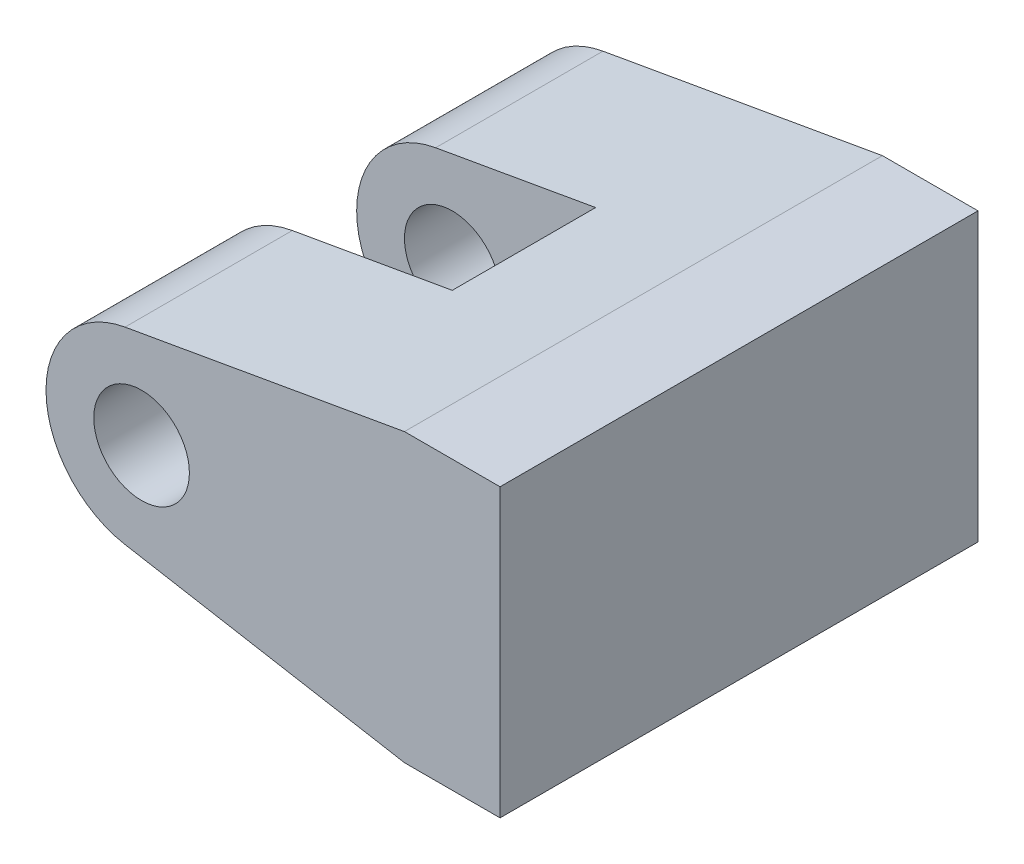
ISO-10303-21;
HEADER;
FILE_DESCRIPTION(('STEP AP214'),'2;1');
FILE_NAME('part.step','',(''),(''),'','','');
FILE_SCHEMA(('AUTOMOTIVE_DESIGN { 1 0 10303 214 1 1 1 1 }'));
ENDSEC;
DATA;
#1=APPLICATION_CONTEXT('core data for automotive mechanical design processes');
#2=APPLICATION_PROTOCOL_DEFINITION('international standard','automotive_design',2000,#1);
#3=PRODUCT_CONTEXT('',#1,'mechanical');
#4=PRODUCT('Part','Part','',(#3));
#5=PRODUCT_RELATED_PRODUCT_CATEGORY('part','',(#4));
#6=PRODUCT_DEFINITION_FORMATION('','',#4);
#7=PRODUCT_DEFINITION_CONTEXT('part definition',#1,'design');
#8=PRODUCT_DEFINITION('design','',#6,#7);
#9=PRODUCT_DEFINITION_SHAPE('','',#8);
#10=(LENGTH_UNIT() NAMED_UNIT(*) SI_UNIT(.MILLI.,.METRE.));
#11=(NAMED_UNIT(*) PLANE_ANGLE_UNIT() SI_UNIT($,.RADIAN.));
#12=(NAMED_UNIT(*) SI_UNIT($,.STERADIAN.) SOLID_ANGLE_UNIT());
#13=UNCERTAINTY_MEASURE_WITH_UNIT(LENGTH_MEASURE(1.E-05),#10,'distance_accuracy_value','');
#14=(GEOMETRIC_REPRESENTATION_CONTEXT(3) GLOBAL_UNCERTAINTY_ASSIGNED_CONTEXT((#13)) GLOBAL_UNIT_ASSIGNED_CONTEXT((#10,
#11,#12)) REPRESENTATION_CONTEXT('',''));
#15=CARTESIAN_POINT('',(0.,0.,0.));
#16=DIRECTION('',(0.,0.,1.));
#17=DIRECTION('',(1.,0.,0.));
#18=AXIS2_PLACEMENT_3D('',#15,#16,#17);
#19=CARTESIAN_POINT('',(-15.5880400826723,30.,50.));
#20=DIRECTION('',(0.,0.,-1.));
#21=DIRECTION('',(-1.,0.,0.));
#22=AXIS2_PLACEMENT_3D('',#19,#20,#21);
#23=CYLINDRICAL_SURFACE('',#22,20.);
#24=DIRECTION('',(0.,0.,-1.));
#25=VECTOR('',#24,1.);
#26=CARTESIAN_POINT('',(-19.0588747988796,49.6965303130468,50.));
#27=LINE('',#26,#25);
#28=CARTESIAN_POINT('',(-19.0588747988796,49.6965303130468,50.));
#29=VERTEX_POINT('',#28);
#30=CARTESIAN_POINT('',(-19.0588747988796,49.6965303130468,15.));
#31=VERTEX_POINT('',#30);
#32=EDGE_CURVE('E188',#29,#31,#27,.T.);
#33=ORIENTED_EDGE('',*,*,#32,.T.);
#34=CARTESIAN_POINT('',(-15.5880400826723,30.,15.));
#35=DIRECTION('',(0.,0.,-1.));
#36=DIRECTION('',(-1.,0.,0.));
#37=AXIS2_PLACEMENT_3D('',#34,#35,#36);
#38=CIRCLE('',#37,20.);
#39=CARTESIAN_POINT('',(-19.0588747988796,10.3034696869533,15.));
#40=VERTEX_POINT('',#39);
#41=EDGE_CURVE('E113',#31,#40,#38,.F.);
#42=ORIENTED_EDGE('',*,*,#41,.T.);
#43=DIRECTION('',(0.,0.,-1.));
#44=VECTOR('',#43,1.);
#45=CARTESIAN_POINT('',(-19.0588747988796,10.3034696869533,50.));
#46=LINE('',#45,#44);
#47=CARTESIAN_POINT('',(-19.0588747988796,10.3034696869533,50.));
#48=VERTEX_POINT('',#47);
#49=EDGE_CURVE('E184',#48,#40,#46,.T.);
#50=ORIENTED_EDGE('',*,*,#49,.F.);
#51=CARTESIAN_POINT('',(-15.5880400826723,30.,50.));
#52=DIRECTION('',(0.,0.,-1.));
#53=DIRECTION('',(-1.,0.,0.));
#54=AXIS2_PLACEMENT_3D('',#51,#52,#53);
#55=CIRCLE('',#54,20.);
#56=EDGE_CURVE('E165',#48,#29,#55,.T.);
#57=ORIENTED_EDGE('',*,*,#56,.T.);
#58=EDGE_LOOP('',(#33,#42,#50,#57));
#59=FACE_BOUND('',#58,.T.);
#60=ADVANCED_FACE('F36',(#59),#23,.T.);
#61=CARTESIAN_POINT('',(-15.5880400826723,30.,50.));
#62=DIRECTION('',(0.,0.,-1.));
#63=DIRECTION('',(-1.,0.,0.));
#64=AXIS2_PLACEMENT_3D('',#61,#62,#63);
#65=CYLINDRICAL_SURFACE('',#64,10.);
#66=CARTESIAN_POINT('',(-15.5880400826723,30.,50.));
#67=DIRECTION('',(0.,0.,1.));
#68=DIRECTION('',(1.,0.,0.));
#69=AXIS2_PLACEMENT_3D('',#66,#67,#68);
#70=CIRCLE('',#69,10.);
#71=CARTESIAN_POINT('',(-5.58804008267227,30.,50.));
#72=VERTEX_POINT('',#71);
#73=EDGE_CURVE('E134',#72,#72,#70,.T.);
#74=ORIENTED_EDGE('',*,*,#73,.T.);
#75=EDGE_LOOP('',(#74));
#76=FACE_BOUND('',#75,.T.);
#77=CARTESIAN_POINT('',(-15.5880400826723,30.,15.));
#78=DIRECTION('',(0.,0.,-1.));
#79=DIRECTION('',(-1.,0.,0.));
#80=AXIS2_PLACEMENT_3D('',#77,#78,#79);
#81=CIRCLE('',#80,10.);
#82=CARTESIAN_POINT('',(-25.5880400826723,30.,15.));
#83=VERTEX_POINT('',#82);
#84=EDGE_CURVE('E191',#83,#83,#81,.T.);
#85=ORIENTED_EDGE('',*,*,#84,.T.);
#86=EDGE_LOOP('',(#85));
#87=FACE_BOUND('',#86,.T.);
#88=ADVANCED_FACE('F240',(#76,#87),#65,.F.);
#89=CARTESIAN_POINT('',(-15.5880400826723,30.,50.));
#90=DIRECTION('',(0.,0.,-1.));
#91=DIRECTION('',(-1.,0.,0.));
#92=AXIS2_PLACEMENT_3D('',#89,#90,#91);
#93=PLANE('',#92);
#94=DIRECTION('',(1.,0.,0.));
#95=VECTOR('',#94,1.);
#96=CARTESIAN_POINT('',(39.4119599173277,60.,50.));
#97=LINE('',#96,#95);
#98=CARTESIAN_POINT('',(39.4119599173277,60.,50.));
#99=VERTEX_POINT('',#98);
#100=CARTESIAN_POINT('',(59.4119599173277,60.,50.));
#101=VERTEX_POINT('',#100);
#102=EDGE_CURVE('E146',#99,#101,#97,.T.);
#103=ORIENTED_EDGE('',*,*,#102,.F.);
#104=DIRECTION('',(-0.984826515652338,-0.173541735810366,0.));
#105=VECTOR('',#104,1.);
#106=CARTESIAN_POINT('',(39.4119599173277,60.,50.));
#107=LINE('',#106,#105);
#108=EDGE_CURVE('E161',#99,#29,#107,.T.);
#109=ORIENTED_EDGE('',*,*,#108,.T.);
#110=ORIENTED_EDGE('',*,*,#56,.F.);
#111=DIRECTION('',(-0.984826515652338,0.173541735810367,0.));
#112=VECTOR('',#111,1.);
#113=CARTESIAN_POINT('',(39.4119599173277,0.,50.));
#114=LINE('',#113,#112);
#115=CARTESIAN_POINT('',(39.4119599173277,0.,50.));
#116=VERTEX_POINT('',#115);
#117=EDGE_CURVE('E168',#116,#48,#114,.T.);
#118=ORIENTED_EDGE('',*,*,#117,.F.);
#119=DIRECTION('',(1.,0.,0.));
#120=VECTOR('',#119,1.);
#121=CARTESIAN_POINT('',(39.4119599173277,0.,50.));
#122=LINE('',#121,#120);
#123=CARTESIAN_POINT('',(59.4119599173277,0.,50.));
#124=VERTEX_POINT('',#123);
#125=EDGE_CURVE('E171',#116,#124,#122,.T.);
#126=ORIENTED_EDGE('',*,*,#125,.T.);
#127=DIRECTION('',(0.,1.,0.));
#128=VECTOR('',#127,1.);
#129=CARTESIAN_POINT('',(59.4119599173277,0.,50.));
#130=LINE('',#129,#128);
#131=EDGE_CURVE('E174',#124,#101,#130,.T.);
#132=ORIENTED_EDGE('',*,*,#131,.T.);
#133=EDGE_LOOP('',(#103,#109,#110,#118,#126,#132));
#134=FACE_BOUND('',#133,.T.);
#135=ORIENTED_EDGE('',*,*,#73,.F.);
#136=EDGE_LOOP('',(#135));
#137=FACE_BOUND('',#136,.T.);
#138=ADVANCED_FACE('F213',(#134,#137),#93,.F.);
#139=CARTESIAN_POINT('',(-15.5880400826723,30.,-50.));
#140=DIRECTION('',(0.,0.,-1.));
#141=DIRECTION('',(-1.,0.,0.));
#142=AXIS2_PLACEMENT_3D('',#139,#140,#141);
#143=PLANE('',#142);
#144=DIRECTION('',(1.,0.,0.));
#145=VECTOR('',#144,1.);
#146=CARTESIAN_POINT('',(39.4119599173277,60.,-50.));
#147=LINE('',#146,#145);
#148=CARTESIAN_POINT('',(39.4119599173277,60.,-50.));
#149=VERTEX_POINT('',#148);
#150=CARTESIAN_POINT('',(59.4119599173277,60.,-50.));
#151=VERTEX_POINT('',#150);
#152=EDGE_CURVE('E142',#149,#151,#147,.T.);
#153=ORIENTED_EDGE('',*,*,#152,.T.);
#154=DIRECTION('',(0.,1.,0.));
#155=VECTOR('',#154,1.);
#156=CARTESIAN_POINT('',(59.4119599173277,0.,-50.));
#157=LINE('',#156,#155);
#158=CARTESIAN_POINT('',(59.4119599173277,0.,-50.));
#159=VERTEX_POINT('',#158);
#160=EDGE_CURVE('E156',#159,#151,#157,.T.);
#161=ORIENTED_EDGE('',*,*,#160,.F.);
#162=DIRECTION('',(1.,0.,0.));
#163=VECTOR('',#162,1.);
#164=CARTESIAN_POINT('',(39.4119599173277,0.,-50.));
#165=LINE('',#164,#163);
#166=CARTESIAN_POINT('',(39.4119599173277,0.,-50.));
#167=VERTEX_POINT('',#166);
#168=EDGE_CURVE('E153',#167,#159,#165,.T.);
#169=ORIENTED_EDGE('',*,*,#168,.F.);
#170=DIRECTION('',(-0.984826515652338,0.173541735810367,0.));
#171=VECTOR('',#170,1.);
#172=CARTESIAN_POINT('',(39.4119599173277,0.,-50.));
#173=LINE('',#172,#171);
#174=CARTESIAN_POINT('',(-19.0588747988796,10.3034696869533,-50.));
#175=VERTEX_POINT('',#174);
#176=EDGE_CURVE('E150',#167,#175,#173,.T.);
#177=ORIENTED_EDGE('',*,*,#176,.T.);
#178=CARTESIAN_POINT('',(-15.5880400826723,30.,-50.));
#179=DIRECTION('',(0.,0.,-1.));
#180=DIRECTION('',(-1.,0.,0.));
#181=AXIS2_PLACEMENT_3D('',#178,#179,#180);
#182=CIRCLE('',#181,20.);
#183=CARTESIAN_POINT('',(-19.0588747988796,49.6965303130468,-50.));
#184=VERTEX_POINT('',#183);
#185=EDGE_CURVE('E147',#175,#184,#182,.T.);
#186=ORIENTED_EDGE('',*,*,#185,.T.);
#187=DIRECTION('',(-0.984826515652338,-0.173541735810366,0.));
#188=VECTOR('',#187,1.);
#189=CARTESIAN_POINT('',(39.4119599173277,60.,-50.));
#190=LINE('',#189,#188);
#191=EDGE_CURVE('E143',#149,#184,#190,.T.);
#192=ORIENTED_EDGE('',*,*,#191,.F.);
#193=EDGE_LOOP('',(#153,#161,#169,#177,#186,#192));
#194=FACE_BOUND('',#193,.T.);
#195=CARTESIAN_POINT('',(-15.5880400826723,30.,-50.));
#196=DIRECTION('',(0.,0.,1.));
#197=DIRECTION('',(1.,0.,0.));
#198=AXIS2_PLACEMENT_3D('',#195,#196,#197);
#199=CIRCLE('',#198,10.);
#200=CARTESIAN_POINT('',(-5.58804008267227,30.,-50.));
#201=VERTEX_POINT('',#200);
#202=EDGE_CURVE('E131',#201,#201,#199,.T.);
#203=ORIENTED_EDGE('',*,*,#202,.T.);
#204=EDGE_LOOP('',(#203));
#205=FACE_BOUND('',#204,.T.);
#206=ADVANCED_FACE('F222',(#194,#205),#143,.T.);
#207=CARTESIAN_POINT('',(39.4119599173277,60.,50.));
#208=DIRECTION('',(0.,1.,0.));
#209=DIRECTION('',(0.,0.,1.));
#210=AXIS2_PLACEMENT_3D('',#207,#208,#209);
#211=PLANE('',#210);
#212=DIRECTION('',(0.,0.,-1.));
#213=VECTOR('',#212,1.);
#214=CARTESIAN_POINT('',(39.4119599173277,60.,50.));
#215=LINE('',#214,#213);
#216=EDGE_CURVE('E44',#99,#149,#215,.T.);
#217=ORIENTED_EDGE('',*,*,#216,.F.);
#218=ORIENTED_EDGE('',*,*,#102,.T.);
#219=DIRECTION('',(0.,0.,-1.));
#220=VECTOR('',#219,1.);
#221=CARTESIAN_POINT('',(59.4119599173277,60.,50.));
#222=LINE('',#221,#220);
#223=EDGE_CURVE('E164',#101,#151,#222,.T.);
#224=ORIENTED_EDGE('',*,*,#223,.T.);
#225=ORIENTED_EDGE('',*,*,#152,.F.);
#226=EDGE_LOOP('',(#217,#218,#224,#225));
#227=FACE_BOUND('',#226,.T.);
#228=ADVANCED_FACE('F217',(#227),#211,.T.);
#229=CARTESIAN_POINT('',(39.4119599173277,60.,50.));
#230=DIRECTION('',(0.173541735810366,-0.984826515652338,0.));
#231=DIRECTION('',(0.984826515652338,0.173541735810366,0.));
#232=AXIS2_PLACEMENT_3D('',#229,#230,#231);
#233=PLANE('',#232);
#234=CARTESIAN_POINT('',(-19.0588747988796,49.6965303130468,-15.));
#235=VERTEX_POINT('',#234);
#236=EDGE_CURVE('E187',#235,#184,#27,.T.);
#237=ORIENTED_EDGE('',*,*,#236,.F.);
#238=DIRECTION('',(0.984826515652338,0.173541735810366,0.));
#239=VECTOR('',#238,1.);
#240=CARTESIAN_POINT('',(39.4119599173277,60.,-15.));
#241=LINE('',#240,#239);
#242=CARTESIAN_POINT('',(14.4119599173277,55.5946115114647,-15.));
#243=VERTEX_POINT('',#242);
#244=EDGE_CURVE('E130',#235,#243,#241,.T.);
#245=ORIENTED_EDGE('',*,*,#244,.T.);
#246=DIRECTION('',(0.,0.,1.));
#247=VECTOR('',#246,1.);
#248=CARTESIAN_POINT('',(14.4119599173277,55.5946115114647,50.));
#249=LINE('',#248,#247);
#250=CARTESIAN_POINT('',(14.4119599173277,55.5946115114647,15.));
#251=VERTEX_POINT('',#250);
#252=EDGE_CURVE('E122',#243,#251,#249,.T.);
#253=ORIENTED_EDGE('',*,*,#252,.T.);
#254=DIRECTION('',(0.984826515652338,0.173541735810366,0.));
#255=VECTOR('',#254,1.);
#256=CARTESIAN_POINT('',(39.4119599173277,60.,15.));
#257=LINE('',#256,#255);
#258=EDGE_CURVE('E110',#31,#251,#257,.T.);
#259=ORIENTED_EDGE('',*,*,#258,.F.);
#260=ORIENTED_EDGE('',*,*,#32,.F.);
#261=ORIENTED_EDGE('',*,*,#108,.F.);
#262=ORIENTED_EDGE('',*,*,#216,.T.);
#263=ORIENTED_EDGE('',*,*,#191,.T.);
#264=EDGE_LOOP('',(#237,#245,#253,#259,#260,#261,#262,#263));
#265=FACE_BOUND('',#264,.T.);
#266=ADVANCED_FACE('F38',(#265),#233,.F.);
#267=CARTESIAN_POINT('',(-15.5880400826723,30.,-15.));
#268=DIRECTION('',(0.,0.,-1.));
#269=DIRECTION('',(-1.,0.,0.));
#270=AXIS2_PLACEMENT_3D('',#267,#268,#269);
#271=CIRCLE('',#270,20.);
#272=CARTESIAN_POINT('',(-19.0588747988796,10.3034696869533,-15.));
#273=VERTEX_POINT('',#272);
#274=EDGE_CURVE('E136',#235,#273,#271,.F.);
#275=ORIENTED_EDGE('',*,*,#274,.F.);
#276=ORIENTED_EDGE('',*,*,#236,.T.);
#277=ORIENTED_EDGE('',*,*,#185,.F.);
#278=EDGE_CURVE('E183',#273,#175,#46,.T.);
#279=ORIENTED_EDGE('',*,*,#278,.F.);
#280=EDGE_LOOP('',(#275,#276,#277,#279));
#281=FACE_BOUND('',#280,.T.);
#282=ADVANCED_FACE('F232',(#281),#23,.T.);
#283=CARTESIAN_POINT('',(39.4119599173277,0.,50.));
#284=DIRECTION('',(-0.173541735810367,-0.984826515652338,0.));
#285=DIRECTION('',(0.984826515652338,-0.173541735810367,0.));
#286=AXIS2_PLACEMENT_3D('',#283,#284,#285);
#287=PLANE('',#286);
#288=DIRECTION('',(0.984826515652338,-0.173541735810367,0.));
#289=VECTOR('',#288,1.);
#290=CARTESIAN_POINT('',(39.4119599173277,0.,-15.));
#291=LINE('',#290,#289);
#292=CARTESIAN_POINT('',(14.4119599173277,4.40538848853534,-15.));
#293=VERTEX_POINT('',#292);
#294=EDGE_CURVE('E195',#273,#293,#291,.T.);
#295=ORIENTED_EDGE('',*,*,#294,.F.);
#296=ORIENTED_EDGE('',*,*,#278,.T.);
#297=ORIENTED_EDGE('',*,*,#176,.F.);
#298=DIRECTION('',(0.,0.,-1.));
#299=VECTOR('',#298,1.);
#300=CARTESIAN_POINT('',(39.4119599173277,0.,50.));
#301=LINE('',#300,#299);
#302=EDGE_CURVE('E181',#116,#167,#301,.T.);
#303=ORIENTED_EDGE('',*,*,#302,.F.);
#304=ORIENTED_EDGE('',*,*,#117,.T.);
#305=ORIENTED_EDGE('',*,*,#49,.T.);
#306=DIRECTION('',(0.984826515652338,-0.173541735810367,0.));
#307=VECTOR('',#306,1.);
#308=CARTESIAN_POINT('',(39.4119599173277,0.,15.));
#309=LINE('',#308,#307);
#310=CARTESIAN_POINT('',(14.4119599173277,4.40538848853534,15.));
#311=VERTEX_POINT('',#310);
#312=EDGE_CURVE('E193',#40,#311,#309,.T.);
#313=ORIENTED_EDGE('',*,*,#312,.T.);
#314=DIRECTION('',(0.,0.,1.));
#315=VECTOR('',#314,1.);
#316=CARTESIAN_POINT('',(14.4119599173277,4.40538848853534,50.));
#317=LINE('',#316,#315);
#318=EDGE_CURVE('E11',#293,#311,#317,.T.);
#319=ORIENTED_EDGE('',*,*,#318,.F.);
#320=EDGE_LOOP('',(#295,#296,#297,#303,#304,#305,#313,#319));
#321=FACE_BOUND('',#320,.T.);
#322=ADVANCED_FACE('F207',(#321),#287,.T.);
#323=CARTESIAN_POINT('',(39.4119599173277,0.,50.));
#324=DIRECTION('',(0.,1.,0.));
#325=DIRECTION('',(-1.,0.,0.));
#326=AXIS2_PLACEMENT_3D('',#323,#324,#325);
#327=PLANE('',#326);
#328=DIRECTION('',(0.,0.,-1.));
#329=VECTOR('',#328,1.);
#330=CARTESIAN_POINT('',(59.4119599173277,0.,50.));
#331=LINE('',#330,#329);
#332=EDGE_CURVE('E179',#124,#159,#331,.T.);
#333=ORIENTED_EDGE('',*,*,#332,.F.);
#334=ORIENTED_EDGE('',*,*,#125,.F.);
#335=ORIENTED_EDGE('',*,*,#302,.T.);
#336=ORIENTED_EDGE('',*,*,#168,.T.);
#337=EDGE_LOOP('',(#333,#334,#335,#336));
#338=FACE_BOUND('',#337,.T.);
#339=ADVANCED_FACE('F228',(#338),#327,.F.);
#340=CARTESIAN_POINT('',(59.4119599173277,0.,50.));
#341=DIRECTION('',(-1.,0.,0.));
#342=DIRECTION('',(0.,-1.,0.));
#343=AXIS2_PLACEMENT_3D('',#340,#341,#342);
#344=PLANE('',#343);
#345=ORIENTED_EDGE('',*,*,#131,.F.);
#346=ORIENTED_EDGE('',*,*,#332,.T.);
#347=ORIENTED_EDGE('',*,*,#160,.T.);
#348=ORIENTED_EDGE('',*,*,#223,.F.);
#349=EDGE_LOOP('',(#345,#346,#347,#348));
#350=FACE_BOUND('',#349,.T.);
#351=ADVANCED_FACE('F225',(#350),#344,.F.);
#352=CARTESIAN_POINT('',(-15.5880400826723,30.,-15.));
#353=DIRECTION('',(0.,0.,-1.));
#354=DIRECTION('',(-1.,0.,0.));
#355=AXIS2_PLACEMENT_3D('',#352,#353,#354);
#356=CIRCLE('',#355,10.);
#357=CARTESIAN_POINT('',(-25.5880400826723,30.,-15.));
#358=VERTEX_POINT('',#357);
#359=EDGE_CURVE('E117',#358,#358,#356,.T.);
#360=ORIENTED_EDGE('',*,*,#359,.F.);
#361=EDGE_LOOP('',(#360));
#362=FACE_BOUND('',#361,.T.);
#363=ORIENTED_EDGE('',*,*,#202,.F.);
#364=EDGE_LOOP('',(#363));
#365=FACE_BOUND('',#364,.T.);
#366=ADVANCED_FACE('F246',(#362,#365),#65,.F.);
#367=CARTESIAN_POINT('',(14.4119599173277,0.,-15.));
#368=DIRECTION('',(1.,0.,0.));
#369=DIRECTION('',(0.,0.,-1.));
#370=AXIS2_PLACEMENT_3D('',#367,#368,#369);
#371=PLANE('',#370);
#372=DIRECTION('',(0.,1.,0.));
#373=VECTOR('',#372,1.);
#374=CARTESIAN_POINT('',(14.4119599173277,0.,-15.));
#375=LINE('',#374,#373);
#376=EDGE_CURVE('E126',#293,#243,#375,.T.);
#377=ORIENTED_EDGE('',*,*,#376,.F.);
#378=ORIENTED_EDGE('',*,*,#318,.T.);
#379=DIRECTION('',(0.,1.,0.));
#380=VECTOR('',#379,1.);
#381=CARTESIAN_POINT('',(14.4119599173277,0.,15.));
#382=LINE('',#381,#380);
#383=EDGE_CURVE('E51',#311,#251,#382,.T.);
#384=ORIENTED_EDGE('',*,*,#383,.T.);
#385=ORIENTED_EDGE('',*,*,#252,.F.);
#386=EDGE_LOOP('',(#377,#378,#384,#385));
#387=FACE_BOUND('',#386,.T.);
#388=ADVANCED_FACE('F121',(#387),#371,.F.);
#389=CARTESIAN_POINT('',(-45.5880400826723,0.,-15.));
#390=DIRECTION('',(0.,0.,-1.));
#391=DIRECTION('',(-1.,0.,0.));
#392=AXIS2_PLACEMENT_3D('',#389,#390,#391);
#393=PLANE('',#392);
#394=ORIENTED_EDGE('',*,*,#359,.T.);
#395=EDGE_LOOP('',(#394));
#396=FACE_BOUND('',#395,.T.);
#397=ORIENTED_EDGE('',*,*,#274,.T.);
#398=ORIENTED_EDGE('',*,*,#294,.T.);
#399=ORIENTED_EDGE('',*,*,#376,.T.);
#400=ORIENTED_EDGE('',*,*,#244,.F.);
#401=EDGE_LOOP('',(#397,#398,#399,#400));
#402=FACE_BOUND('',#401,.T.);
#403=ADVANCED_FACE('F204',(#396,#402),#393,.F.);
#404=CARTESIAN_POINT('',(-45.5880400826723,0.,15.));
#405=DIRECTION('',(0.,0.,-1.));
#406=DIRECTION('',(-1.,0.,0.));
#407=AXIS2_PLACEMENT_3D('',#404,#405,#406);
#408=PLANE('',#407);
#409=ORIENTED_EDGE('',*,*,#84,.F.);
#410=EDGE_LOOP('',(#409));
#411=FACE_BOUND('',#410,.T.);
#412=ORIENTED_EDGE('',*,*,#258,.T.);
#413=ORIENTED_EDGE('',*,*,#383,.F.);
#414=ORIENTED_EDGE('',*,*,#312,.F.);
#415=ORIENTED_EDGE('',*,*,#41,.F.);
#416=EDGE_LOOP('',(#412,#413,#414,#415));
#417=FACE_BOUND('',#416,.T.);
#418=ADVANCED_FACE('F111',(#411,#417),#408,.T.);
#419=CLOSED_SHELL('',(#60,#88,#138,#206,#228,#266,#282,#322,#339,#351,#366,#388,#403,#418));
#420=MANIFOLD_SOLID_BREP('B2',#419);
#421=ADVANCED_BREP_SHAPE_REPRESENTATION('',(#18,#420),#14);
#422=SHAPE_DEFINITION_REPRESENTATION(#9,#421);
ENDSEC;
END-ISO-10303-21;
